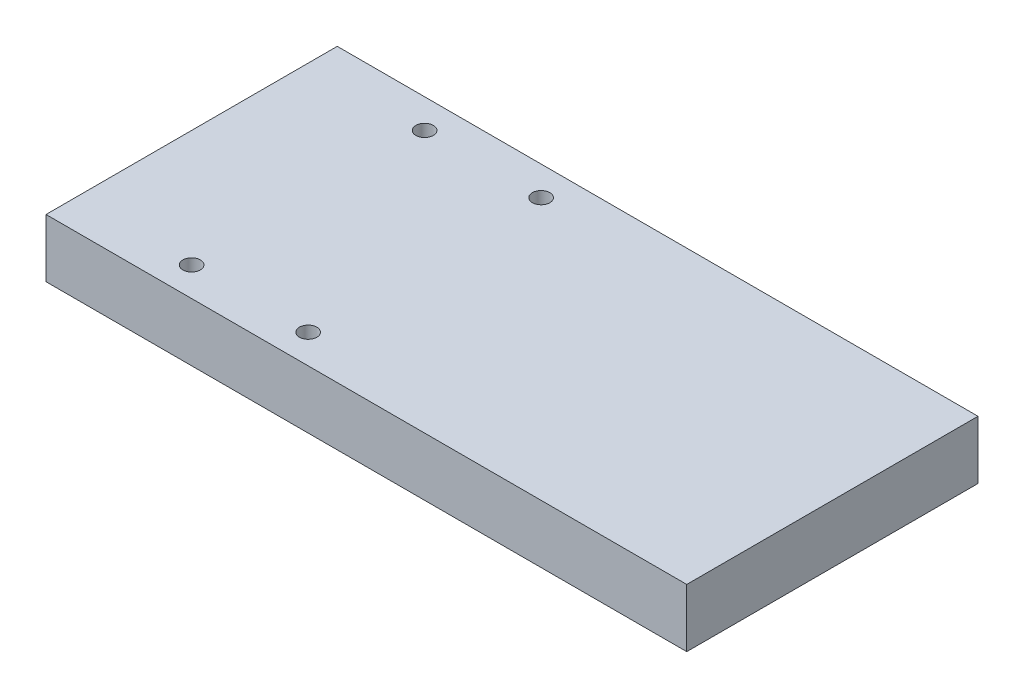
ISO-10303-21;
HEADER;
FILE_DESCRIPTION(('STEP AP214'),'2;1');
FILE_NAME('part.step','',(''),(''),'','','');
FILE_SCHEMA(('AUTOMOTIVE_DESIGN { 1 0 10303 214 1 1 1 1 }'));
ENDSEC;
DATA;
#1=APPLICATION_CONTEXT('core data for automotive mechanical design processes');
#2=APPLICATION_PROTOCOL_DEFINITION('international standard','automotive_design',2000,#1);
#3=PRODUCT_CONTEXT('',#1,'mechanical');
#4=PRODUCT('Part','Part','',(#3));
#5=PRODUCT_RELATED_PRODUCT_CATEGORY('part','',(#4));
#6=PRODUCT_DEFINITION_FORMATION('','',#4);
#7=PRODUCT_DEFINITION_CONTEXT('part definition',#1,'design');
#8=PRODUCT_DEFINITION('design','',#6,#7);
#9=PRODUCT_DEFINITION_SHAPE('','',#8);
#10=(LENGTH_UNIT() NAMED_UNIT(*) SI_UNIT(.MILLI.,.METRE.));
#11=(NAMED_UNIT(*) PLANE_ANGLE_UNIT() SI_UNIT($,.RADIAN.));
#12=(NAMED_UNIT(*) SI_UNIT($,.STERADIAN.) SOLID_ANGLE_UNIT());
#13=UNCERTAINTY_MEASURE_WITH_UNIT(LENGTH_MEASURE(1.E-05),#10,'distance_accuracy_value','');
#14=(GEOMETRIC_REPRESENTATION_CONTEXT(3) GLOBAL_UNCERTAINTY_ASSIGNED_CONTEXT((#13)) GLOBAL_UNIT_ASSIGNED_CONTEXT((#10,
#11,#12)) REPRESENTATION_CONTEXT('',''));
#15=CARTESIAN_POINT('',(0.,0.,0.));
#16=DIRECTION('',(0.,0.,1.));
#17=DIRECTION('',(1.,0.,0.));
#18=AXIS2_PLACEMENT_3D('',#15,#16,#17);
#19=CARTESIAN_POINT('',(0.,20.,0.));
#20=DIRECTION('',(1.,0.,0.));
#21=DIRECTION('',(0.,0.,-1.));
#22=AXIS2_PLACEMENT_3D('',#19,#20,#21);
#23=PLANE('',#22);
#24=DIRECTION('',(0.,0.,1.));
#25=VECTOR('',#24,1.);
#26=CARTESIAN_POINT('',(0.,0.,0.));
#27=LINE('',#26,#25);
#28=CARTESIAN_POINT('',(0.,0.,-100.));
#29=VERTEX_POINT('',#28);
#30=CARTESIAN_POINT('',(0.,0.,0.));
#31=VERTEX_POINT('',#30);
#32=EDGE_CURVE('E96',#29,#31,#27,.T.);
#33=ORIENTED_EDGE('',*,*,#32,.T.);
#34=DIRECTION('',(0.,-1.,0.));
#35=VECTOR('',#34,1.);
#36=CARTESIAN_POINT('',(0.,20.,0.));
#37=LINE('',#36,#35);
#38=CARTESIAN_POINT('',(0.,20.,0.));
#39=VERTEX_POINT('',#38);
#40=EDGE_CURVE('E11',#39,#31,#37,.T.);
#41=ORIENTED_EDGE('',*,*,#40,.F.);
#42=DIRECTION('',(0.,0.,1.));
#43=VECTOR('',#42,1.);
#44=CARTESIAN_POINT('',(0.,20.,0.));
#45=LINE('',#44,#43);
#46=CARTESIAN_POINT('',(0.,20.,-100.));
#47=VERTEX_POINT('',#46);
#48=EDGE_CURVE('E84',#47,#39,#45,.T.);
#49=ORIENTED_EDGE('',*,*,#48,.F.);
#50=DIRECTION('',(0.,-1.,0.));
#51=VECTOR('',#50,1.);
#52=CARTESIAN_POINT('',(0.,20.,-100.));
#53=LINE('',#52,#51);
#54=EDGE_CURVE('E92',#47,#29,#53,.T.);
#55=ORIENTED_EDGE('',*,*,#54,.T.);
#56=EDGE_LOOP('',(#33,#41,#49,#55));
#57=FACE_BOUND('',#56,.T.);
#58=ADVANCED_FACE('F33',(#57),#23,.F.);
#59=CARTESIAN_POINT('',(0.,20.,0.));
#60=DIRECTION('',(0.,0.,-1.));
#61=DIRECTION('',(-1.,0.,0.));
#62=AXIS2_PLACEMENT_3D('',#59,#60,#61);
#63=PLANE('',#62);
#64=DIRECTION('',(1.,0.,0.));
#65=VECTOR('',#64,1.);
#66=CARTESIAN_POINT('',(0.,0.,0.));
#67=LINE('',#66,#65);
#68=CARTESIAN_POINT('',(220.,0.,0.));
#69=VERTEX_POINT('',#68);
#70=EDGE_CURVE('E88',#31,#69,#67,.T.);
#71=ORIENTED_EDGE('',*,*,#70,.T.);
#72=DIRECTION('',(0.,-1.,0.));
#73=VECTOR('',#72,1.);
#74=CARTESIAN_POINT('',(220.,20.,0.));
#75=LINE('',#74,#73);
#76=CARTESIAN_POINT('',(220.,20.,0.));
#77=VERTEX_POINT('',#76);
#78=EDGE_CURVE('E41',#77,#69,#75,.T.);
#79=ORIENTED_EDGE('',*,*,#78,.F.);
#80=DIRECTION('',(1.,0.,0.));
#81=VECTOR('',#80,1.);
#82=CARTESIAN_POINT('',(0.,20.,0.));
#83=LINE('',#82,#81);
#84=EDGE_CURVE('E79',#39,#77,#83,.T.);
#85=ORIENTED_EDGE('',*,*,#84,.F.);
#86=ORIENTED_EDGE('',*,*,#40,.T.);
#87=EDGE_LOOP('',(#71,#79,#85,#86));
#88=FACE_BOUND('',#87,.T.);
#89=ADVANCED_FACE('F87',(#88),#63,.F.);
#90=CARTESIAN_POINT('',(220.,20.,0.));
#91=DIRECTION('',(-1.,0.,0.));
#92=DIRECTION('',(0.,0.,1.));
#93=AXIS2_PLACEMENT_3D('',#90,#91,#92);
#94=PLANE('',#93);
#95=DIRECTION('',(0.,0.,-1.));
#96=VECTOR('',#95,1.);
#97=CARTESIAN_POINT('',(220.,0.,0.));
#98=LINE('',#97,#96);
#99=CARTESIAN_POINT('',(220.,0.,-100.));
#100=VERTEX_POINT('',#99);
#101=EDGE_CURVE('E66',#69,#100,#98,.T.);
#102=ORIENTED_EDGE('',*,*,#101,.T.);
#103=DIRECTION('',(0.,-1.,0.));
#104=VECTOR('',#103,1.);
#105=CARTESIAN_POINT('',(220.,20.,-100.));
#106=LINE('',#105,#104);
#107=CARTESIAN_POINT('',(220.,20.,-100.));
#108=VERTEX_POINT('',#107);
#109=EDGE_CURVE('E89',#108,#100,#106,.T.);
#110=ORIENTED_EDGE('',*,*,#109,.F.);
#111=DIRECTION('',(0.,0.,-1.));
#112=VECTOR('',#111,1.);
#113=CARTESIAN_POINT('',(220.,20.,0.));
#114=LINE('',#113,#112);
#115=EDGE_CURVE('E82',#77,#108,#114,.T.);
#116=ORIENTED_EDGE('',*,*,#115,.F.);
#117=ORIENTED_EDGE('',*,*,#78,.T.);
#118=EDGE_LOOP('',(#102,#110,#116,#117));
#119=FACE_BOUND('',#118,.T.);
#120=ADVANCED_FACE('F90',(#119),#94,.F.);
#121=CARTESIAN_POINT('',(0.,20.,-100.));
#122=DIRECTION('',(0.,0.,1.));
#123=DIRECTION('',(1.,0.,0.));
#124=AXIS2_PLACEMENT_3D('',#121,#122,#123);
#125=PLANE('',#124);
#126=DIRECTION('',(-1.,0.,0.));
#127=VECTOR('',#126,1.);
#128=CARTESIAN_POINT('',(0.,0.,-100.));
#129=LINE('',#128,#127);
#130=EDGE_CURVE('E72',#100,#29,#129,.T.);
#131=ORIENTED_EDGE('',*,*,#130,.T.);
#132=ORIENTED_EDGE('',*,*,#54,.F.);
#133=DIRECTION('',(-1.,0.,0.));
#134=VECTOR('',#133,1.);
#135=CARTESIAN_POINT('',(0.,20.,-100.));
#136=LINE('',#135,#134);
#137=EDGE_CURVE('E49',#108,#47,#136,.T.);
#138=ORIENTED_EDGE('',*,*,#137,.F.);
#139=ORIENTED_EDGE('',*,*,#109,.T.);
#140=EDGE_LOOP('',(#131,#132,#138,#139));
#141=FACE_BOUND('',#140,.T.);
#142=ADVANCED_FACE('F104',(#141),#125,.F.);
#143=CARTESIAN_POINT('',(0.,20.,0.));
#144=DIRECTION('',(0.,-1.,0.));
#145=DIRECTION('',(0.,0.,-1.));
#146=AXIS2_PLACEMENT_3D('',#143,#144,#145);
#147=PLANE('',#146);
#148=CARTESIAN_POINT('',(80.,20.,-10.));
#149=DIRECTION('',(0.,1.,0.));
#150=DIRECTION('',(0.,0.,1.));
#151=AXIS2_PLACEMENT_3D('',#148,#149,#150);
#152=CIRCLE('',#151,3.00000000000001);
#153=CARTESIAN_POINT('',(80.,20.,-6.99999999999999));
#154=VERTEX_POINT('',#153);
#155=EDGE_CURVE('E128',#154,#154,#152,.T.);
#156=ORIENTED_EDGE('',*,*,#155,.F.);
#157=EDGE_LOOP('',(#156));
#158=FACE_BOUND('',#157,.T.);
#159=CARTESIAN_POINT('',(40.,20.,-10.));
#160=DIRECTION('',(0.,1.,0.));
#161=DIRECTION('',(0.,0.,1.));
#162=AXIS2_PLACEMENT_3D('',#159,#160,#161);
#163=CIRCLE('',#162,3.);
#164=CARTESIAN_POINT('',(40.,20.,-7.));
#165=VERTEX_POINT('',#164);
#166=EDGE_CURVE('E122',#165,#165,#163,.T.);
#167=ORIENTED_EDGE('',*,*,#166,.F.);
#168=EDGE_LOOP('',(#167));
#169=FACE_BOUND('',#168,.T.);
#170=CARTESIAN_POINT('',(80.,20.,-90.));
#171=DIRECTION('',(0.,1.,0.));
#172=DIRECTION('',(0.,0.,1.));
#173=AXIS2_PLACEMENT_3D('',#170,#171,#172);
#174=CIRCLE('',#173,3.00000000000001);
#175=CARTESIAN_POINT('',(80.,20.,-87.));
#176=VERTEX_POINT('',#175);
#177=EDGE_CURVE('E116',#176,#176,#174,.T.);
#178=ORIENTED_EDGE('',*,*,#177,.F.);
#179=EDGE_LOOP('',(#178));
#180=FACE_BOUND('',#179,.T.);
#181=CARTESIAN_POINT('',(40.,20.,-90.));
#182=DIRECTION('',(0.,1.,0.));
#183=DIRECTION('',(0.,0.,1.));
#184=AXIS2_PLACEMENT_3D('',#181,#182,#183);
#185=CIRCLE('',#184,3.);
#186=CARTESIAN_POINT('',(40.,20.,-87.));
#187=VERTEX_POINT('',#186);
#188=EDGE_CURVE('E110',#187,#187,#185,.T.);
#189=ORIENTED_EDGE('',*,*,#188,.F.);
#190=EDGE_LOOP('',(#189));
#191=FACE_BOUND('',#190,.T.);
#192=ORIENTED_EDGE('',*,*,#48,.T.);
#193=ORIENTED_EDGE('',*,*,#84,.T.);
#194=ORIENTED_EDGE('',*,*,#115,.T.);
#195=ORIENTED_EDGE('',*,*,#137,.T.);
#196=EDGE_LOOP('',(#192,#193,#194,#195));
#197=FACE_BOUND('',#196,.T.);
#198=ADVANCED_FACE('F80',(#158,#169,#180,#191,#197),#147,.F.);
#199=CARTESIAN_POINT('',(0.,0.,0.));
#200=DIRECTION('',(0.,-1.,0.));
#201=DIRECTION('',(0.,0.,-1.));
#202=AXIS2_PLACEMENT_3D('',#199,#200,#201);
#203=PLANE('',#202);
#204=CARTESIAN_POINT('',(80.,0.,-10.));
#205=DIRECTION('',(0.,1.,0.));
#206=DIRECTION('',(0.,0.,1.));
#207=AXIS2_PLACEMENT_3D('',#204,#205,#206);
#208=CIRCLE('',#207,3.00000000000001);
#209=CARTESIAN_POINT('',(80.,0.,-6.99999999999999));
#210=VERTEX_POINT('',#209);
#211=EDGE_CURVE('E125',#210,#210,#208,.T.);
#212=ORIENTED_EDGE('',*,*,#211,.T.);
#213=EDGE_LOOP('',(#212));
#214=FACE_BOUND('',#213,.T.);
#215=CARTESIAN_POINT('',(40.,0.,-10.));
#216=DIRECTION('',(0.,1.,0.));
#217=DIRECTION('',(0.,0.,1.));
#218=AXIS2_PLACEMENT_3D('',#215,#216,#217);
#219=CIRCLE('',#218,3.);
#220=CARTESIAN_POINT('',(40.,0.,-7.));
#221=VERTEX_POINT('',#220);
#222=EDGE_CURVE('E119',#221,#221,#219,.T.);
#223=ORIENTED_EDGE('',*,*,#222,.T.);
#224=EDGE_LOOP('',(#223));
#225=FACE_BOUND('',#224,.T.);
#226=CARTESIAN_POINT('',(80.,0.,-90.));
#227=DIRECTION('',(0.,1.,0.));
#228=DIRECTION('',(0.,0.,1.));
#229=AXIS2_PLACEMENT_3D('',#226,#227,#228);
#230=CIRCLE('',#229,3.00000000000001);
#231=CARTESIAN_POINT('',(80.,0.,-87.));
#232=VERTEX_POINT('',#231);
#233=EDGE_CURVE('E113',#232,#232,#230,.T.);
#234=ORIENTED_EDGE('',*,*,#233,.T.);
#235=EDGE_LOOP('',(#234));
#236=FACE_BOUND('',#235,.T.);
#237=CARTESIAN_POINT('',(40.,0.,-90.));
#238=DIRECTION('',(0.,1.,0.));
#239=DIRECTION('',(0.,0.,1.));
#240=AXIS2_PLACEMENT_3D('',#237,#238,#239);
#241=CIRCLE('',#240,3.);
#242=CARTESIAN_POINT('',(40.,0.,-87.));
#243=VERTEX_POINT('',#242);
#244=EDGE_CURVE('E99',#243,#243,#241,.T.);
#245=ORIENTED_EDGE('',*,*,#244,.T.);
#246=EDGE_LOOP('',(#245));
#247=FACE_BOUND('',#246,.T.);
#248=ORIENTED_EDGE('',*,*,#32,.F.);
#249=ORIENTED_EDGE('',*,*,#130,.F.);
#250=ORIENTED_EDGE('',*,*,#101,.F.);
#251=ORIENTED_EDGE('',*,*,#70,.F.);
#252=EDGE_LOOP('',(#248,#249,#250,#251));
#253=FACE_BOUND('',#252,.T.);
#254=ADVANCED_FACE('F107',(#214,#225,#236,#247,#253),#203,.T.);
#255=CARTESIAN_POINT('',(40.,0.,-90.));
#256=DIRECTION('',(0.,1.,0.));
#257=DIRECTION('',(0.,0.,1.));
#258=AXIS2_PLACEMENT_3D('',#255,#256,#257);
#259=CYLINDRICAL_SURFACE('',#258,3.);
#260=ORIENTED_EDGE('',*,*,#244,.F.);
#261=EDGE_LOOP('',(#260));
#262=FACE_BOUND('',#261,.T.);
#263=ORIENTED_EDGE('',*,*,#188,.T.);
#264=EDGE_LOOP('',(#263));
#265=FACE_BOUND('',#264,.T.);
#266=ADVANCED_FACE('F152',(#262,#265),#259,.F.);
#267=CARTESIAN_POINT('',(80.,0.,-90.));
#268=DIRECTION('',(0.,1.,0.));
#269=DIRECTION('',(0.,0.,1.));
#270=AXIS2_PLACEMENT_3D('',#267,#268,#269);
#271=CYLINDRICAL_SURFACE('',#270,3.00000000000001);
#272=ORIENTED_EDGE('',*,*,#233,.F.);
#273=EDGE_LOOP('',(#272));
#274=FACE_BOUND('',#273,.T.);
#275=ORIENTED_EDGE('',*,*,#177,.T.);
#276=EDGE_LOOP('',(#275));
#277=FACE_BOUND('',#276,.T.);
#278=ADVANCED_FACE('F154',(#274,#277),#271,.F.);
#279=CARTESIAN_POINT('',(40.,0.,-10.));
#280=DIRECTION('',(0.,1.,0.));
#281=DIRECTION('',(0.,0.,1.));
#282=AXIS2_PLACEMENT_3D('',#279,#280,#281);
#283=CYLINDRICAL_SURFACE('',#282,3.);
#284=ORIENTED_EDGE('',*,*,#222,.F.);
#285=EDGE_LOOP('',(#284));
#286=FACE_BOUND('',#285,.T.);
#287=ORIENTED_EDGE('',*,*,#166,.T.);
#288=EDGE_LOOP('',(#287));
#289=FACE_BOUND('',#288,.T.);
#290=ADVANCED_FACE('F139',(#286,#289),#283,.F.);
#291=CARTESIAN_POINT('',(80.,0.,-10.));
#292=DIRECTION('',(0.,1.,0.));
#293=DIRECTION('',(0.,0.,1.));
#294=AXIS2_PLACEMENT_3D('',#291,#292,#293);
#295=CYLINDRICAL_SURFACE('',#294,3.00000000000001);
#296=ORIENTED_EDGE('',*,*,#211,.F.);
#297=EDGE_LOOP('',(#296));
#298=FACE_BOUND('',#297,.T.);
#299=ORIENTED_EDGE('',*,*,#155,.T.);
#300=EDGE_LOOP('',(#299));
#301=FACE_BOUND('',#300,.T.);
#302=ADVANCED_FACE('F136',(#298,#301),#295,.F.);
#303=CLOSED_SHELL('',(#58,#89,#120,#142,#198,#254,#266,#278,#290,#302));
#304=MANIFOLD_SOLID_BREP('B2',#303);
#305=ADVANCED_BREP_SHAPE_REPRESENTATION('',(#18,#304),#14);
#306=SHAPE_DEFINITION_REPRESENTATION(#9,#305);
ENDSEC;
END-ISO-10303-21;
